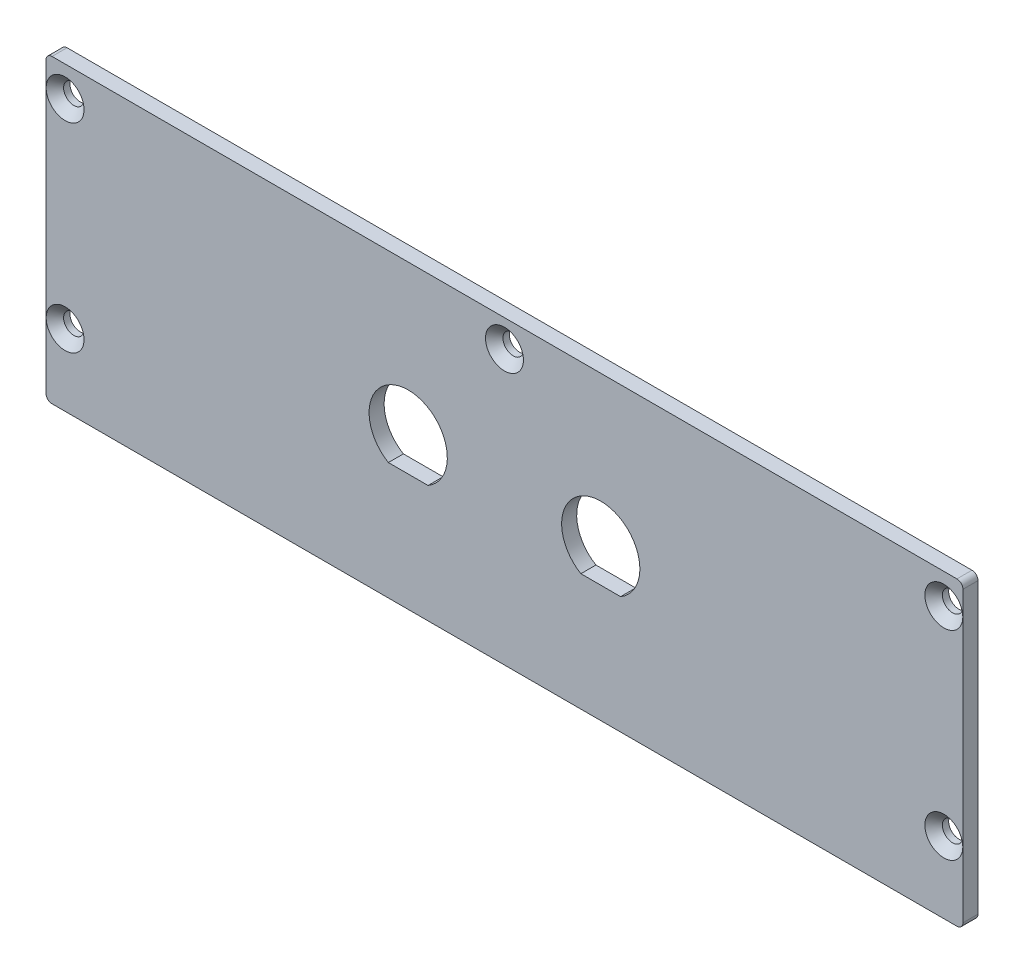
ISO-10303-21;
HEADER;
FILE_DESCRIPTION(('STEP AP214'),'2;1');
FILE_NAME('part.step','',(''),(''),'','','');
FILE_SCHEMA(('AUTOMOTIVE_DESIGN { 1 0 10303 214 1 1 1 1 }'));
ENDSEC;
DATA;
#1=APPLICATION_CONTEXT('core data for automotive mechanical design processes');
#2=APPLICATION_PROTOCOL_DEFINITION('international standard','automotive_design',2000,#1);
#3=PRODUCT_CONTEXT('',#1,'mechanical');
#4=PRODUCT('Part','Part','',(#3));
#5=PRODUCT_RELATED_PRODUCT_CATEGORY('part','',(#4));
#6=PRODUCT_DEFINITION_FORMATION('','',#4);
#7=PRODUCT_DEFINITION_CONTEXT('part definition',#1,'design');
#8=PRODUCT_DEFINITION('design','',#6,#7);
#9=PRODUCT_DEFINITION_SHAPE('','',#8);
#10=(LENGTH_UNIT() NAMED_UNIT(*) SI_UNIT(.MILLI.,.METRE.));
#11=(NAMED_UNIT(*) PLANE_ANGLE_UNIT() SI_UNIT($,.RADIAN.));
#12=(NAMED_UNIT(*) SI_UNIT($,.STERADIAN.) SOLID_ANGLE_UNIT());
#13=UNCERTAINTY_MEASURE_WITH_UNIT(LENGTH_MEASURE(1.E-05),#10,'distance_accuracy_value','');
#14=(GEOMETRIC_REPRESENTATION_CONTEXT(3) GLOBAL_UNCERTAINTY_ASSIGNED_CONTEXT((#13)) GLOBAL_UNIT_ASSIGNED_CONTEXT((#10,
#11,#12)) REPRESENTATION_CONTEXT('',''));
#15=CARTESIAN_POINT('',(0.,0.,0.));
#16=DIRECTION('',(0.,0.,1.));
#17=DIRECTION('',(1.,0.,0.));
#18=AXIS2_PLACEMENT_3D('',#15,#16,#17);
#19=CARTESIAN_POINT('',(75.2,-10.5598186222573,2.5));
#20=DIRECTION('',(0.,0.,-1.));
#21=DIRECTION('',(-1.,0.,0.));
#22=AXIS2_PLACEMENT_3D('',#19,#20,#21);
#23=CYLINDRICAL_SURFACE('',#22,1.);
#24=CARTESIAN_POINT('',(75.2,-10.5598186222573,0.));
#25=DIRECTION('',(0.,0.,1.));
#26=DIRECTION('',(-1.,0.,0.));
#27=AXIS2_PLACEMENT_3D('',#24,#25,#26);
#28=CIRCLE('',#27,1.);
#29=CARTESIAN_POINT('',(75.2,-11.5598186222573,0.));
#30=VERTEX_POINT('',#29);
#31=CARTESIAN_POINT('',(76.2,-10.5598186222573,0.));
#32=VERTEX_POINT('',#31);
#33=EDGE_CURVE('E199',#30,#32,#28,.T.);
#34=ORIENTED_EDGE('',*,*,#33,.T.);
#35=DIRECTION('',(0.,0.,-1.));
#36=VECTOR('',#35,1.);
#37=CARTESIAN_POINT('',(76.2,-10.5598186222573,2.5));
#38=LINE('',#37,#36);
#39=CARTESIAN_POINT('',(76.2,-10.5598186222573,2.5));
#40=VERTEX_POINT('',#39);
#41=EDGE_CURVE('E11',#40,#32,#38,.T.);
#42=ORIENTED_EDGE('',*,*,#41,.F.);
#43=CARTESIAN_POINT('',(75.2,-10.5598186222573,2.5));
#44=DIRECTION('',(0.,0.,1.));
#45=DIRECTION('',(-1.,0.,0.));
#46=AXIS2_PLACEMENT_3D('',#43,#44,#45);
#47=CIRCLE('',#46,1.);
#48=CARTESIAN_POINT('',(75.2,-11.5598186222573,2.5));
#49=VERTEX_POINT('',#48);
#50=EDGE_CURVE('E200',#49,#40,#47,.T.);
#51=ORIENTED_EDGE('',*,*,#50,.F.);
#52=DIRECTION('',(0.,0.,-1.));
#53=VECTOR('',#52,1.);
#54=CARTESIAN_POINT('',(75.2,-11.5598186222573,2.5));
#55=LINE('',#54,#53);
#56=EDGE_CURVE('E218',#49,#30,#55,.T.);
#57=ORIENTED_EDGE('',*,*,#56,.T.);
#58=EDGE_LOOP('',(#34,#42,#51,#57));
#59=FACE_BOUND('',#58,.T.);
#60=ADVANCED_FACE('F33',(#59),#23,.T.);
#61=CARTESIAN_POINT('',(76.2,37.4401813777427,2.5));
#62=DIRECTION('',(-1.,0.,0.));
#63=DIRECTION('',(0.,-1.,0.));
#64=AXIS2_PLACEMENT_3D('',#61,#62,#63);
#65=PLANE('',#64);
#66=DIRECTION('',(0.,1.,0.));
#67=VECTOR('',#66,1.);
#68=CARTESIAN_POINT('',(76.2,37.4401813777427,0.));
#69=LINE('',#68,#67);
#70=CARTESIAN_POINT('',(76.2,37.4401813777427,0.));
#71=VERTEX_POINT('',#70);
#72=EDGE_CURVE('E221',#32,#71,#69,.T.);
#73=ORIENTED_EDGE('',*,*,#72,.T.);
#74=DIRECTION('',(0.,0.,-1.));
#75=VECTOR('',#74,1.);
#76=CARTESIAN_POINT('',(76.2,37.4401813777427,2.5));
#77=LINE('',#76,#75);
#78=CARTESIAN_POINT('',(76.2,37.4401813777427,2.5));
#79=VERTEX_POINT('',#78);
#80=EDGE_CURVE('E40',#79,#71,#77,.T.);
#81=ORIENTED_EDGE('',*,*,#80,.F.);
#82=DIRECTION('',(0.,1.,0.));
#83=VECTOR('',#82,1.);
#84=CARTESIAN_POINT('',(76.2,37.4401813777427,2.5));
#85=LINE('',#84,#83);
#86=EDGE_CURVE('E203',#40,#79,#85,.T.);
#87=ORIENTED_EDGE('',*,*,#86,.F.);
#88=ORIENTED_EDGE('',*,*,#41,.T.);
#89=EDGE_LOOP('',(#73,#81,#87,#88));
#90=FACE_BOUND('',#89,.T.);
#91=ADVANCED_FACE('F277',(#90),#65,.F.);
#92=CARTESIAN_POINT('',(75.2,37.4401813777427,2.5));
#93=DIRECTION('',(0.,0.,-1.));
#94=DIRECTION('',(-1.,0.,0.));
#95=AXIS2_PLACEMENT_3D('',#92,#93,#94);
#96=CYLINDRICAL_SURFACE('',#95,0.999999999999997);
#97=CARTESIAN_POINT('',(75.2,37.4401813777427,0.));
#98=DIRECTION('',(0.,0.,1.));
#99=DIRECTION('',(1.,0.,0.));
#100=AXIS2_PLACEMENT_3D('',#97,#98,#99);
#101=CIRCLE('',#100,0.999999999999997);
#102=CARTESIAN_POINT('',(75.2,38.4401813777427,0.));
#103=VERTEX_POINT('',#102);
#104=EDGE_CURVE('E223',#71,#103,#101,.T.);
#105=ORIENTED_EDGE('',*,*,#104,.T.);
#106=DIRECTION('',(0.,0.,-1.));
#107=VECTOR('',#106,1.);
#108=CARTESIAN_POINT('',(75.2,38.4401813777427,2.5));
#109=LINE('',#108,#107);
#110=CARTESIAN_POINT('',(75.2,38.4401813777427,2.5));
#111=VERTEX_POINT('',#110);
#112=EDGE_CURVE('E248',#111,#103,#109,.T.);
#113=ORIENTED_EDGE('',*,*,#112,.F.);
#114=CARTESIAN_POINT('',(75.2,37.4401813777427,2.5));
#115=DIRECTION('',(0.,0.,1.));
#116=DIRECTION('',(1.,0.,0.));
#117=AXIS2_PLACEMENT_3D('',#114,#115,#116);
#118=CIRCLE('',#117,0.999999999999997);
#119=EDGE_CURVE('E206',#79,#111,#118,.T.);
#120=ORIENTED_EDGE('',*,*,#119,.F.);
#121=ORIENTED_EDGE('',*,*,#80,.T.);
#122=EDGE_LOOP('',(#105,#113,#120,#121));
#123=FACE_BOUND('',#122,.T.);
#124=ADVANCED_FACE('F255',(#123),#96,.T.);
#125=CARTESIAN_POINT('',(-75.2,38.4401813777427,2.5));
#126=DIRECTION('',(0.,-1.,0.));
#127=DIRECTION('',(0.,0.,-1.));
#128=AXIS2_PLACEMENT_3D('',#125,#126,#127);
#129=PLANE('',#128);
#130=DIRECTION('',(-1.,0.,0.));
#131=VECTOR('',#130,1.);
#132=CARTESIAN_POINT('',(-75.2,38.4401813777427,0.));
#133=LINE('',#132,#131);
#134=CARTESIAN_POINT('',(-75.2,38.4401813777427,0.));
#135=VERTEX_POINT('',#134);
#136=EDGE_CURVE('E225',#103,#135,#133,.T.);
#137=ORIENTED_EDGE('',*,*,#136,.T.);
#138=DIRECTION('',(0.,0.,-1.));
#139=VECTOR('',#138,1.);
#140=CARTESIAN_POINT('',(-75.2,38.4401813777427,2.5));
#141=LINE('',#140,#139);
#142=CARTESIAN_POINT('',(-75.2,38.4401813777427,2.5));
#143=VERTEX_POINT('',#142);
#144=EDGE_CURVE('E245',#143,#135,#141,.T.);
#145=ORIENTED_EDGE('',*,*,#144,.F.);
#146=DIRECTION('',(-1.,0.,0.));
#147=VECTOR('',#146,1.);
#148=CARTESIAN_POINT('',(-75.2,38.4401813777427,2.5));
#149=LINE('',#148,#147);
#150=EDGE_CURVE('E208',#111,#143,#149,.T.);
#151=ORIENTED_EDGE('',*,*,#150,.F.);
#152=ORIENTED_EDGE('',*,*,#112,.T.);
#153=EDGE_LOOP('',(#137,#145,#151,#152));
#154=FACE_BOUND('',#153,.T.);
#155=ADVANCED_FACE('F265',(#154),#129,.F.);
#156=CARTESIAN_POINT('',(-75.2,37.4401813777427,2.5));
#157=DIRECTION('',(0.,0.,-1.));
#158=DIRECTION('',(-1.,0.,0.));
#159=AXIS2_PLACEMENT_3D('',#156,#157,#158);
#160=CYLINDRICAL_SURFACE('',#159,0.999999999999997);
#161=CARTESIAN_POINT('',(-75.2,37.4401813777427,0.));
#162=DIRECTION('',(0.,0.,1.));
#163=DIRECTION('',(1.,0.,0.));
#164=AXIS2_PLACEMENT_3D('',#161,#162,#163);
#165=CIRCLE('',#164,0.999999999999997);
#166=CARTESIAN_POINT('',(-76.2,37.4401813777427,0.));
#167=VERTEX_POINT('',#166);
#168=EDGE_CURVE('E227',#135,#167,#165,.T.);
#169=ORIENTED_EDGE('',*,*,#168,.T.);
#170=DIRECTION('',(0.,0.,-1.));
#171=VECTOR('',#170,1.);
#172=CARTESIAN_POINT('',(-76.2,37.4401813777427,2.5));
#173=LINE('',#172,#171);
#174=CARTESIAN_POINT('',(-76.2,37.4401813777427,2.5));
#175=VERTEX_POINT('',#174);
#176=EDGE_CURVE('E242',#175,#167,#173,.T.);
#177=ORIENTED_EDGE('',*,*,#176,.F.);
#178=CARTESIAN_POINT('',(-75.2,37.4401813777427,2.5));
#179=DIRECTION('',(0.,0.,1.));
#180=DIRECTION('',(1.,0.,0.));
#181=AXIS2_PLACEMENT_3D('',#178,#179,#180);
#182=CIRCLE('',#181,0.999999999999997);
#183=EDGE_CURVE('E210',#143,#175,#182,.T.);
#184=ORIENTED_EDGE('',*,*,#183,.F.);
#185=ORIENTED_EDGE('',*,*,#144,.T.);
#186=EDGE_LOOP('',(#169,#177,#184,#185));
#187=FACE_BOUND('',#186,.T.);
#188=ADVANCED_FACE('F269',(#187),#160,.T.);
#189=CARTESIAN_POINT('',(-76.2,37.4401813777427,2.5));
#190=DIRECTION('',(1.,0.,0.));
#191=DIRECTION('',(0.,1.,0.));
#192=AXIS2_PLACEMENT_3D('',#189,#190,#191);
#193=PLANE('',#192);
#194=DIRECTION('',(0.,-1.,0.));
#195=VECTOR('',#194,1.);
#196=CARTESIAN_POINT('',(-76.2,37.4401813777427,0.));
#197=LINE('',#196,#195);
#198=CARTESIAN_POINT('',(-76.2,-10.5598186222573,0.));
#199=VERTEX_POINT('',#198);
#200=EDGE_CURVE('E229',#167,#199,#197,.T.);
#201=ORIENTED_EDGE('',*,*,#200,.T.);
#202=DIRECTION('',(0.,0.,-1.));
#203=VECTOR('',#202,1.);
#204=CARTESIAN_POINT('',(-76.2,-10.5598186222573,2.5));
#205=LINE('',#204,#203);
#206=CARTESIAN_POINT('',(-76.2,-10.5598186222573,2.5));
#207=VERTEX_POINT('',#206);
#208=EDGE_CURVE('E239',#207,#199,#205,.T.);
#209=ORIENTED_EDGE('',*,*,#208,.F.);
#210=DIRECTION('',(0.,-1.,0.));
#211=VECTOR('',#210,1.);
#212=CARTESIAN_POINT('',(-76.2,37.4401813777427,2.5));
#213=LINE('',#212,#211);
#214=EDGE_CURVE('E212',#175,#207,#213,.T.);
#215=ORIENTED_EDGE('',*,*,#214,.F.);
#216=ORIENTED_EDGE('',*,*,#176,.T.);
#217=EDGE_LOOP('',(#201,#209,#215,#216));
#218=FACE_BOUND('',#217,.T.);
#219=ADVANCED_FACE('F290',(#218),#193,.F.);
#220=CARTESIAN_POINT('',(-75.2,-10.5598186222573,2.5));
#221=DIRECTION('',(0.,0.,-1.));
#222=DIRECTION('',(-1.,0.,0.));
#223=AXIS2_PLACEMENT_3D('',#220,#221,#222);
#224=CYLINDRICAL_SURFACE('',#223,1.);
#225=CARTESIAN_POINT('',(-75.2,-10.5598186222573,0.));
#226=DIRECTION('',(0.,0.,1.));
#227=DIRECTION('',(-1.,0.,0.));
#228=AXIS2_PLACEMENT_3D('',#225,#226,#227);
#229=CIRCLE('',#228,1.);
#230=CARTESIAN_POINT('',(-75.2,-11.5598186222573,0.));
#231=VERTEX_POINT('',#230);
#232=EDGE_CURVE('E231',#199,#231,#229,.T.);
#233=ORIENTED_EDGE('',*,*,#232,.T.);
#234=DIRECTION('',(0.,0.,-1.));
#235=VECTOR('',#234,1.);
#236=CARTESIAN_POINT('',(-75.2,-11.5598186222573,2.5));
#237=LINE('',#236,#235);
#238=CARTESIAN_POINT('',(-75.2,-11.5598186222573,2.5));
#239=VERTEX_POINT('',#238);
#240=EDGE_CURVE('E236',#239,#231,#237,.T.);
#241=ORIENTED_EDGE('',*,*,#240,.F.);
#242=CARTESIAN_POINT('',(-75.2,-10.5598186222573,2.5));
#243=DIRECTION('',(0.,0.,1.));
#244=DIRECTION('',(-1.,0.,0.));
#245=AXIS2_PLACEMENT_3D('',#242,#243,#244);
#246=CIRCLE('',#245,1.);
#247=EDGE_CURVE('E214',#207,#239,#246,.T.);
#248=ORIENTED_EDGE('',*,*,#247,.F.);
#249=ORIENTED_EDGE('',*,*,#208,.T.);
#250=EDGE_LOOP('',(#233,#241,#248,#249));
#251=FACE_BOUND('',#250,.T.);
#252=ADVANCED_FACE('F288',(#251),#224,.T.);
#253=CARTESIAN_POINT('',(-75.2,-11.5598186222573,2.5));
#254=DIRECTION('',(0.,1.,0.));
#255=DIRECTION('',(0.,0.,1.));
#256=AXIS2_PLACEMENT_3D('',#253,#254,#255);
#257=PLANE('',#256);
#258=DIRECTION('',(1.,0.,0.));
#259=VECTOR('',#258,1.);
#260=CARTESIAN_POINT('',(-75.2,-11.5598186222573,0.));
#261=LINE('',#260,#259);
#262=EDGE_CURVE('E204',#231,#30,#261,.T.);
#263=ORIENTED_EDGE('',*,*,#262,.T.);
#264=ORIENTED_EDGE('',*,*,#56,.F.);
#265=DIRECTION('',(1.,0.,0.));
#266=VECTOR('',#265,1.);
#267=CARTESIAN_POINT('',(-75.2,-11.5598186222573,2.5));
#268=LINE('',#267,#266);
#269=EDGE_CURVE('E216',#239,#49,#268,.T.);
#270=ORIENTED_EDGE('',*,*,#269,.F.);
#271=ORIENTED_EDGE('',*,*,#240,.T.);
#272=EDGE_LOOP('',(#263,#264,#270,#271));
#273=FACE_BOUND('',#272,.T.);
#274=ADVANCED_FACE('F283',(#273),#257,.F.);
#275=CARTESIAN_POINT('',(75.2,-10.5598186222573,2.5));
#276=DIRECTION('',(0.,0.,-1.));
#277=DIRECTION('',(-1.,0.,0.));
#278=AXIS2_PLACEMENT_3D('',#275,#276,#277);
#279=PLANE('',#278);
#280=CARTESIAN_POINT('',(16.,13.5355698148128,2.5));
#281=DIRECTION('',(0.,0.,1.));
#282=DIRECTION('',(1.,0.,0.));
#283=AXIS2_PLACEMENT_3D('',#280,#281,#282);
#284=CIRCLE('',#283,6.5);
#285=CARTESIAN_POINT('',(19.3,7.93556981481283,2.5));
#286=VERTEX_POINT('',#285);
#287=CARTESIAN_POINT('',(12.7,7.93556981481283,2.5));
#288=VERTEX_POINT('',#287);
#289=EDGE_CURVE('E132',#286,#288,#284,.T.);
#290=ORIENTED_EDGE('',*,*,#289,.F.);
#291=DIRECTION('',(1.,0.,0.));
#292=VECTOR('',#291,1.);
#293=CARTESIAN_POINT('',(0.,7.93556981481283,2.5));
#294=LINE('',#293,#292);
#295=EDGE_CURVE('E47',#288,#286,#294,.T.);
#296=ORIENTED_EDGE('',*,*,#295,.F.);
#297=EDGE_LOOP('',(#290,#296));
#298=FACE_BOUND('',#297,.T.);
#299=CARTESIAN_POINT('',(-16.,13.5355698148128,2.5));
#300=DIRECTION('',(0.,0.,1.));
#301=DIRECTION('',(1.,0.,0.));
#302=AXIS2_PLACEMENT_3D('',#299,#300,#301);
#303=CIRCLE('',#302,6.5);
#304=CARTESIAN_POINT('',(-12.7,7.93556981481283,2.5));
#305=VERTEX_POINT('',#304);
#306=CARTESIAN_POINT('',(-19.3,7.93556981481283,2.5));
#307=VERTEX_POINT('',#306);
#308=EDGE_CURVE('E143',#305,#307,#303,.T.);
#309=ORIENTED_EDGE('',*,*,#308,.F.);
#310=DIRECTION('',(1.,0.,0.));
#311=VECTOR('',#310,1.);
#312=CARTESIAN_POINT('',(0.,7.93556981481283,2.5));
#313=LINE('',#312,#311);
#314=EDGE_CURVE('E137',#307,#305,#313,.T.);
#315=ORIENTED_EDGE('',*,*,#314,.F.);
#316=EDGE_LOOP('',(#309,#315));
#317=FACE_BOUND('',#316,.T.);
#318=CARTESIAN_POINT('',(-73.025,33.4401813777427,2.5));
#319=DIRECTION('',(0.,0.,1.));
#320=DIRECTION('',(1.,0.,0.));
#321=AXIS2_PLACEMENT_3D('',#318,#319,#320);
#322=CIRCLE('',#321,3.15);
#323=CARTESIAN_POINT('',(-69.875,33.4401813777427,2.5));
#324=VERTEX_POINT('',#323);
#325=EDGE_CURVE('E152',#324,#324,#322,.T.);
#326=ORIENTED_EDGE('',*,*,#325,.F.);
#327=EDGE_LOOP('',(#326));
#328=FACE_BOUND('',#327,.T.);
#329=CARTESIAN_POINT('',(-73.025,0.34018137774275,2.5));
#330=DIRECTION('',(0.,0.,1.));
#331=DIRECTION('',(1.,0.,0.));
#332=AXIS2_PLACEMENT_3D('',#329,#330,#331);
#333=CIRCLE('',#332,3.15);
#334=CARTESIAN_POINT('',(-69.875,0.34018137774275,2.5));
#335=VERTEX_POINT('',#334);
#336=EDGE_CURVE('E163',#335,#335,#333,.T.);
#337=ORIENTED_EDGE('',*,*,#336,.F.);
#338=EDGE_LOOP('',(#337));
#339=FACE_BOUND('',#338,.T.);
#340=CARTESIAN_POINT('',(0.,33.91520047402,2.5));
#341=DIRECTION('',(0.,0.,1.));
#342=DIRECTION('',(1.,0.,0.));
#343=AXIS2_PLACEMENT_3D('',#340,#341,#342);
#344=CIRCLE('',#343,3.15);
#345=CARTESIAN_POINT('',(3.14999999999997,33.91520047402,2.5));
#346=VERTEX_POINT('',#345);
#347=EDGE_CURVE('E172',#346,#346,#344,.T.);
#348=ORIENTED_EDGE('',*,*,#347,.F.);
#349=EDGE_LOOP('',(#348));
#350=FACE_BOUND('',#349,.T.);
#351=CARTESIAN_POINT('',(73.025,33.4401813777428,2.5));
#352=DIRECTION('',(0.,0.,1.));
#353=DIRECTION('',(1.,0.,0.));
#354=AXIS2_PLACEMENT_3D('',#351,#352,#353);
#355=CIRCLE('',#354,3.15);
#356=CARTESIAN_POINT('',(76.175,33.4401813777428,2.5));
#357=VERTEX_POINT('',#356);
#358=EDGE_CURVE('E181',#357,#357,#355,.T.);
#359=ORIENTED_EDGE('',*,*,#358,.F.);
#360=EDGE_LOOP('',(#359));
#361=FACE_BOUND('',#360,.T.);
#362=CARTESIAN_POINT('',(73.025,0.34018137774282,2.5));
#363=DIRECTION('',(0.,0.,1.));
#364=DIRECTION('',(1.,0.,0.));
#365=AXIS2_PLACEMENT_3D('',#362,#363,#364);
#366=CIRCLE('',#365,3.15);
#367=CARTESIAN_POINT('',(76.175,0.34018137774282,2.5));
#368=VERTEX_POINT('',#367);
#369=EDGE_CURVE('E190',#368,#368,#366,.T.);
#370=ORIENTED_EDGE('',*,*,#369,.F.);
#371=EDGE_LOOP('',(#370));
#372=FACE_BOUND('',#371,.T.);
#373=ORIENTED_EDGE('',*,*,#50,.T.);
#374=ORIENTED_EDGE('',*,*,#86,.T.);
#375=ORIENTED_EDGE('',*,*,#119,.T.);
#376=ORIENTED_EDGE('',*,*,#150,.T.);
#377=ORIENTED_EDGE('',*,*,#183,.T.);
#378=ORIENTED_EDGE('',*,*,#214,.T.);
#379=ORIENTED_EDGE('',*,*,#247,.T.);
#380=ORIENTED_EDGE('',*,*,#269,.T.);
#381=EDGE_LOOP('',(#373,#374,#375,#376,#377,#378,#379,#380));
#382=FACE_BOUND('',#381,.T.);
#383=ADVANCED_FACE('F273',(#298,#317,#328,#339,#350,#361,#372,#382),#279,.F.);
#384=CARTESIAN_POINT('',(75.2,-10.5598186222573,0.));
#385=DIRECTION('',(0.,0.,-1.));
#386=DIRECTION('',(-1.,0.,0.));
#387=AXIS2_PLACEMENT_3D('',#384,#385,#386);
#388=PLANE('',#387);
#389=DIRECTION('',(1.,0.,0.));
#390=VECTOR('',#389,1.);
#391=CARTESIAN_POINT('',(0.,7.93556981481283,0.));
#392=LINE('',#391,#390);
#393=CARTESIAN_POINT('',(12.7,7.93556981481283,0.));
#394=VERTEX_POINT('',#393);
#395=CARTESIAN_POINT('',(19.3,7.93556981481283,0.));
#396=VERTEX_POINT('',#395);
#397=EDGE_CURVE('E52',#394,#396,#392,.T.);
#398=ORIENTED_EDGE('',*,*,#397,.T.);
#399=CARTESIAN_POINT('',(16.,13.5355698148128,0.));
#400=DIRECTION('',(0.,0.,1.));
#401=DIRECTION('',(1.,0.,0.));
#402=AXIS2_PLACEMENT_3D('',#399,#400,#401);
#403=CIRCLE('',#402,6.5);
#404=EDGE_CURVE('E124',#396,#394,#403,.T.);
#405=ORIENTED_EDGE('',*,*,#404,.T.);
#406=EDGE_LOOP('',(#398,#405));
#407=FACE_BOUND('',#406,.T.);
#408=DIRECTION('',(1.,0.,0.));
#409=VECTOR('',#408,1.);
#410=CARTESIAN_POINT('',(0.,7.93556981481283,0.));
#411=LINE('',#410,#409);
#412=CARTESIAN_POINT('',(-19.3,7.93556981481283,0.));
#413=VERTEX_POINT('',#412);
#414=CARTESIAN_POINT('',(-12.7,7.93556981481283,0.));
#415=VERTEX_POINT('',#414);
#416=EDGE_CURVE('E139',#413,#415,#411,.T.);
#417=ORIENTED_EDGE('',*,*,#416,.T.);
#418=CARTESIAN_POINT('',(-16.,13.5355698148128,0.));
#419=DIRECTION('',(0.,0.,1.));
#420=DIRECTION('',(1.,0.,0.));
#421=AXIS2_PLACEMENT_3D('',#418,#419,#420);
#422=CIRCLE('',#421,6.5);
#423=EDGE_CURVE('E142',#415,#413,#422,.T.);
#424=ORIENTED_EDGE('',*,*,#423,.T.);
#425=EDGE_LOOP('',(#417,#424));
#426=FACE_BOUND('',#425,.T.);
#427=CARTESIAN_POINT('',(-73.025,33.4401813777427,0.));
#428=DIRECTION('',(0.,0.,1.));
#429=DIRECTION('',(1.,0.,0.));
#430=AXIS2_PLACEMENT_3D('',#427,#428,#429);
#431=CIRCLE('',#430,1.69999999999999);
#432=CARTESIAN_POINT('',(-71.325,33.4401813777427,0.));
#433=VERTEX_POINT('',#432);
#434=EDGE_CURVE('E160',#433,#433,#431,.T.);
#435=ORIENTED_EDGE('',*,*,#434,.T.);
#436=EDGE_LOOP('',(#435));
#437=FACE_BOUND('',#436,.T.);
#438=CARTESIAN_POINT('',(-73.025,0.34018137774275,0.));
#439=DIRECTION('',(0.,0.,1.));
#440=DIRECTION('',(1.,0.,0.));
#441=AXIS2_PLACEMENT_3D('',#438,#439,#440);
#442=CIRCLE('',#441,1.69999999999999);
#443=CARTESIAN_POINT('',(-71.325,0.34018137774275,0.));
#444=VERTEX_POINT('',#443);
#445=EDGE_CURVE('E169',#444,#444,#442,.T.);
#446=ORIENTED_EDGE('',*,*,#445,.T.);
#447=EDGE_LOOP('',(#446));
#448=FACE_BOUND('',#447,.T.);
#449=CARTESIAN_POINT('',(0.,33.91520047402,0.));
#450=DIRECTION('',(0.,0.,1.));
#451=DIRECTION('',(1.,0.,0.));
#452=AXIS2_PLACEMENT_3D('',#449,#450,#451);
#453=CIRCLE('',#452,1.7);
#454=CARTESIAN_POINT('',(1.69999999999996,33.91520047402,0.));
#455=VERTEX_POINT('',#454);
#456=EDGE_CURVE('E178',#455,#455,#453,.T.);
#457=ORIENTED_EDGE('',*,*,#456,.T.);
#458=EDGE_LOOP('',(#457));
#459=FACE_BOUND('',#458,.T.);
#460=CARTESIAN_POINT('',(73.025,33.4401813777428,0.));
#461=DIRECTION('',(0.,0.,1.));
#462=DIRECTION('',(1.,0.,0.));
#463=AXIS2_PLACEMENT_3D('',#460,#461,#462);
#464=CIRCLE('',#463,1.69999999999999);
#465=CARTESIAN_POINT('',(74.725,33.4401813777428,0.));
#466=VERTEX_POINT('',#465);
#467=EDGE_CURVE('E187',#466,#466,#464,.T.);
#468=ORIENTED_EDGE('',*,*,#467,.T.);
#469=EDGE_LOOP('',(#468));
#470=FACE_BOUND('',#469,.T.);
#471=CARTESIAN_POINT('',(73.025,0.34018137774282,0.));
#472=DIRECTION('',(0.,0.,1.));
#473=DIRECTION('',(1.,0.,0.));
#474=AXIS2_PLACEMENT_3D('',#471,#472,#473);
#475=CIRCLE('',#474,1.69999999999999);
#476=CARTESIAN_POINT('',(74.725,0.34018137774282,0.));
#477=VERTEX_POINT('',#476);
#478=EDGE_CURVE('E196',#477,#477,#475,.T.);
#479=ORIENTED_EDGE('',*,*,#478,.T.);
#480=EDGE_LOOP('',(#479));
#481=FACE_BOUND('',#480,.T.);
#482=ORIENTED_EDGE('',*,*,#33,.F.);
#483=ORIENTED_EDGE('',*,*,#262,.F.);
#484=ORIENTED_EDGE('',*,*,#232,.F.);
#485=ORIENTED_EDGE('',*,*,#200,.F.);
#486=ORIENTED_EDGE('',*,*,#168,.F.);
#487=ORIENTED_EDGE('',*,*,#136,.F.);
#488=ORIENTED_EDGE('',*,*,#104,.F.);
#489=ORIENTED_EDGE('',*,*,#72,.F.);
#490=EDGE_LOOP('',(#482,#483,#484,#485,#486,#487,#488,#489));
#491=FACE_BOUND('',#490,.T.);
#492=ADVANCED_FACE('F130',(#407,#426,#437,#448,#459,#470,#481,#491),#388,.T.);
#493=CARTESIAN_POINT('',(73.025,0.34018137774282,2.5));
#494=DIRECTION('',(0.,0.,1.));
#495=DIRECTION('',(1.,0.,0.));
#496=AXIS2_PLACEMENT_3D('',#493,#494,#495);
#497=CYLINDRICAL_SURFACE('',#496,1.69999999999999);
#498=ORIENTED_EDGE('',*,*,#478,.F.);
#499=EDGE_LOOP('',(#498));
#500=FACE_BOUND('',#499,.T.);
#501=CARTESIAN_POINT('',(73.025,0.34018137774282,1.05));
#502=DIRECTION('',(0.,0.,1.));
#503=DIRECTION('',(1.,0.,0.));
#504=AXIS2_PLACEMENT_3D('',#501,#502,#503);
#505=CIRCLE('',#504,1.69999999999999);
#506=CARTESIAN_POINT('',(74.725,0.34018137774282,1.05));
#507=VERTEX_POINT('',#506);
#508=EDGE_CURVE('E193',#507,#507,#505,.T.);
#509=ORIENTED_EDGE('',*,*,#508,.T.);
#510=EDGE_LOOP('',(#509));
#511=FACE_BOUND('',#510,.T.);
#512=ADVANCED_FACE('F342',(#500,#511),#497,.F.);
#513=CARTESIAN_POINT('',(73.025,0.34018137774282,2.5));
#514=DIRECTION('',(0.,0.,1.));
#515=DIRECTION('',(1.,0.,0.));
#516=AXIS2_PLACEMENT_3D('',#513,#514,#515);
#517=CONICAL_SURFACE('',#516,3.15,0.785398163397449);
#518=ORIENTED_EDGE('',*,*,#508,.F.);
#519=EDGE_LOOP('',(#518));
#520=FACE_BOUND('',#519,.T.);
#521=ORIENTED_EDGE('',*,*,#369,.T.);
#522=EDGE_LOOP('',(#521));
#523=FACE_BOUND('',#522,.T.);
#524=ADVANCED_FACE('F347',(#520,#523),#517,.F.);
#525=CARTESIAN_POINT('',(73.025,33.4401813777428,2.5));
#526=DIRECTION('',(0.,0.,1.));
#527=DIRECTION('',(1.,0.,0.));
#528=AXIS2_PLACEMENT_3D('',#525,#526,#527);
#529=CYLINDRICAL_SURFACE('',#528,1.69999999999999);
#530=ORIENTED_EDGE('',*,*,#467,.F.);
#531=EDGE_LOOP('',(#530));
#532=FACE_BOUND('',#531,.T.);
#533=CARTESIAN_POINT('',(73.025,33.4401813777428,1.05));
#534=DIRECTION('',(0.,0.,1.));
#535=DIRECTION('',(1.,0.,0.));
#536=AXIS2_PLACEMENT_3D('',#533,#534,#535);
#537=CIRCLE('',#536,1.69999999999999);
#538=CARTESIAN_POINT('',(74.725,33.4401813777428,1.05));
#539=VERTEX_POINT('',#538);
#540=EDGE_CURVE('E184',#539,#539,#537,.T.);
#541=ORIENTED_EDGE('',*,*,#540,.T.);
#542=EDGE_LOOP('',(#541));
#543=FACE_BOUND('',#542,.T.);
#544=ADVANCED_FACE('F359',(#532,#543),#529,.F.);
#545=CARTESIAN_POINT('',(73.025,33.4401813777428,2.5));
#546=DIRECTION('',(0.,0.,1.));
#547=DIRECTION('',(1.,0.,0.));
#548=AXIS2_PLACEMENT_3D('',#545,#546,#547);
#549=CONICAL_SURFACE('',#548,3.15,0.785398163397449);
#550=ORIENTED_EDGE('',*,*,#540,.F.);
#551=EDGE_LOOP('',(#550));
#552=FACE_BOUND('',#551,.T.);
#553=ORIENTED_EDGE('',*,*,#358,.T.);
#554=EDGE_LOOP('',(#553));
#555=FACE_BOUND('',#554,.T.);
#556=ADVANCED_FACE('F369',(#552,#555),#549,.F.);
#557=CARTESIAN_POINT('',(0.,33.91520047402,2.5));
#558=DIRECTION('',(0.,0.,1.));
#559=DIRECTION('',(1.,0.,0.));
#560=AXIS2_PLACEMENT_3D('',#557,#558,#559);
#561=CYLINDRICAL_SURFACE('',#560,1.7);
#562=ORIENTED_EDGE('',*,*,#456,.F.);
#563=EDGE_LOOP('',(#562));
#564=FACE_BOUND('',#563,.T.);
#565=CARTESIAN_POINT('',(0.,33.91520047402,1.05));
#566=DIRECTION('',(0.,0.,1.));
#567=DIRECTION('',(1.,0.,0.));
#568=AXIS2_PLACEMENT_3D('',#565,#566,#567);
#569=CIRCLE('',#568,1.7);
#570=CARTESIAN_POINT('',(1.69999999999996,33.91520047402,1.05));
#571=VERTEX_POINT('',#570);
#572=EDGE_CURVE('E175',#571,#571,#569,.T.);
#573=ORIENTED_EDGE('',*,*,#572,.T.);
#574=EDGE_LOOP('',(#573));
#575=FACE_BOUND('',#574,.T.);
#576=ADVANCED_FACE('F379',(#564,#575),#561,.F.);
#577=CARTESIAN_POINT('',(0.,33.91520047402,2.5));
#578=DIRECTION('',(0.,0.,1.));
#579=DIRECTION('',(1.,0.,0.));
#580=AXIS2_PLACEMENT_3D('',#577,#578,#579);
#581=CONICAL_SURFACE('',#580,3.15,0.785398163397447);
#582=ORIENTED_EDGE('',*,*,#572,.F.);
#583=EDGE_LOOP('',(#582));
#584=FACE_BOUND('',#583,.T.);
#585=ORIENTED_EDGE('',*,*,#347,.T.);
#586=EDGE_LOOP('',(#585));
#587=FACE_BOUND('',#586,.T.);
#588=ADVANCED_FACE('F389',(#584,#587),#581,.F.);
#589=CARTESIAN_POINT('',(-73.025,0.34018137774275,2.5));
#590=DIRECTION('',(0.,0.,1.));
#591=DIRECTION('',(1.,0.,0.));
#592=AXIS2_PLACEMENT_3D('',#589,#590,#591);
#593=CYLINDRICAL_SURFACE('',#592,1.69999999999999);
#594=ORIENTED_EDGE('',*,*,#445,.F.);
#595=EDGE_LOOP('',(#594));
#596=FACE_BOUND('',#595,.T.);
#597=CARTESIAN_POINT('',(-73.025,0.34018137774275,1.05));
#598=DIRECTION('',(0.,0.,1.));
#599=DIRECTION('',(1.,0.,0.));
#600=AXIS2_PLACEMENT_3D('',#597,#598,#599);
#601=CIRCLE('',#600,1.69999999999999);
#602=CARTESIAN_POINT('',(-71.325,0.34018137774275,1.05));
#603=VERTEX_POINT('',#602);
#604=EDGE_CURVE('E166',#603,#603,#601,.T.);
#605=ORIENTED_EDGE('',*,*,#604,.T.);
#606=EDGE_LOOP('',(#605));
#607=FACE_BOUND('',#606,.T.);
#608=ADVANCED_FACE('F399',(#596,#607),#593,.F.);
#609=CARTESIAN_POINT('',(-73.025,0.34018137774275,2.5));
#610=DIRECTION('',(0.,0.,1.));
#611=DIRECTION('',(1.,0.,0.));
#612=AXIS2_PLACEMENT_3D('',#609,#610,#611);
#613=CONICAL_SURFACE('',#612,3.15,0.785398163397449);
#614=ORIENTED_EDGE('',*,*,#604,.F.);
#615=EDGE_LOOP('',(#614));
#616=FACE_BOUND('',#615,.T.);
#617=ORIENTED_EDGE('',*,*,#336,.T.);
#618=EDGE_LOOP('',(#617));
#619=FACE_BOUND('',#618,.T.);
#620=ADVANCED_FACE('F409',(#616,#619),#613,.F.);
#621=CARTESIAN_POINT('',(-73.025,33.4401813777427,2.5));
#622=DIRECTION('',(0.,0.,1.));
#623=DIRECTION('',(1.,0.,0.));
#624=AXIS2_PLACEMENT_3D('',#621,#622,#623);
#625=CYLINDRICAL_SURFACE('',#624,1.69999999999999);
#626=ORIENTED_EDGE('',*,*,#434,.F.);
#627=EDGE_LOOP('',(#626));
#628=FACE_BOUND('',#627,.T.);
#629=CARTESIAN_POINT('',(-73.025,33.4401813777427,1.05));
#630=DIRECTION('',(0.,0.,1.));
#631=DIRECTION('',(1.,0.,0.));
#632=AXIS2_PLACEMENT_3D('',#629,#630,#631);
#633=CIRCLE('',#632,1.69999999999999);
#634=CARTESIAN_POINT('',(-71.325,33.4401813777427,1.05));
#635=VERTEX_POINT('',#634);
#636=EDGE_CURVE('E157',#635,#635,#633,.T.);
#637=ORIENTED_EDGE('',*,*,#636,.T.);
#638=EDGE_LOOP('',(#637));
#639=FACE_BOUND('',#638,.T.);
#640=ADVANCED_FACE('F419',(#628,#639),#625,.F.);
#641=CARTESIAN_POINT('',(-73.025,33.4401813777427,2.5));
#642=DIRECTION('',(0.,0.,1.));
#643=DIRECTION('',(1.,0.,0.));
#644=AXIS2_PLACEMENT_3D('',#641,#642,#643);
#645=CONICAL_SURFACE('',#644,3.15,0.785398163397449);
#646=ORIENTED_EDGE('',*,*,#636,.F.);
#647=EDGE_LOOP('',(#646));
#648=FACE_BOUND('',#647,.T.);
#649=ORIENTED_EDGE('',*,*,#325,.T.);
#650=EDGE_LOOP('',(#649));
#651=FACE_BOUND('',#650,.T.);
#652=ADVANCED_FACE('F429',(#648,#651),#645,.F.);
#653=CARTESIAN_POINT('',(0.,7.93556981481283,0.));
#654=DIRECTION('',(0.,-1.,0.));
#655=DIRECTION('',(0.,0.,-1.));
#656=AXIS2_PLACEMENT_3D('',#653,#654,#655);
#657=PLANE('',#656);
#658=ORIENTED_EDGE('',*,*,#314,.T.);
#659=DIRECTION('',(0.,0.,1.));
#660=VECTOR('',#659,1.);
#661=CARTESIAN_POINT('',(-12.7,7.93556981481283,0.));
#662=LINE('',#661,#660);
#663=EDGE_CURVE('E146',#415,#305,#662,.T.);
#664=ORIENTED_EDGE('',*,*,#663,.F.);
#665=ORIENTED_EDGE('',*,*,#416,.F.);
#666=DIRECTION('',(0.,0.,1.));
#667=VECTOR('',#666,1.);
#668=CARTESIAN_POINT('',(-19.3,7.93556981481283,0.));
#669=LINE('',#668,#667);
#670=EDGE_CURVE('E150',#413,#307,#669,.T.);
#671=ORIENTED_EDGE('',*,*,#670,.T.);
#672=EDGE_LOOP('',(#658,#664,#665,#671));
#673=FACE_BOUND('',#672,.T.);
#674=ADVANCED_FACE('F439',(#673),#657,.F.);
#675=CARTESIAN_POINT('',(-16.,13.5355698148128,0.));
#676=DIRECTION('',(0.,0.,1.));
#677=DIRECTION('',(1.,0.,0.));
#678=AXIS2_PLACEMENT_3D('',#675,#676,#677);
#679=CYLINDRICAL_SURFACE('',#678,6.5);
#680=ORIENTED_EDGE('',*,*,#308,.T.);
#681=ORIENTED_EDGE('',*,*,#670,.F.);
#682=ORIENTED_EDGE('',*,*,#423,.F.);
#683=ORIENTED_EDGE('',*,*,#663,.T.);
#684=EDGE_LOOP('',(#680,#681,#682,#683));
#685=FACE_BOUND('',#684,.T.);
#686=ADVANCED_FACE('F458',(#685),#679,.F.);
#687=CARTESIAN_POINT('',(0.,7.93556981481283,0.));
#688=DIRECTION('',(0.,-1.,0.));
#689=DIRECTION('',(0.,0.,-1.));
#690=AXIS2_PLACEMENT_3D('',#687,#688,#689);
#691=PLANE('',#690);
#692=ORIENTED_EDGE('',*,*,#295,.T.);
#693=DIRECTION('',(0.,0.,1.));
#694=VECTOR('',#693,1.);
#695=CARTESIAN_POINT('',(19.3,7.93556981481283,0.));
#696=LINE('',#695,#694);
#697=EDGE_CURVE('E117',#396,#286,#696,.T.);
#698=ORIENTED_EDGE('',*,*,#697,.F.);
#699=ORIENTED_EDGE('',*,*,#397,.F.);
#700=DIRECTION('',(0.,0.,1.));
#701=VECTOR('',#700,1.);
#702=CARTESIAN_POINT('',(12.7,7.93556981481283,0.));
#703=LINE('',#702,#701);
#704=EDGE_CURVE('E123',#394,#288,#703,.T.);
#705=ORIENTED_EDGE('',*,*,#704,.T.);
#706=EDGE_LOOP('',(#692,#698,#699,#705));
#707=FACE_BOUND('',#706,.T.);
#708=ADVANCED_FACE('F119',(#707),#691,.F.);
#709=CARTESIAN_POINT('',(16.,13.5355698148128,0.));
#710=DIRECTION('',(0.,0.,1.));
#711=DIRECTION('',(1.,0.,0.));
#712=AXIS2_PLACEMENT_3D('',#709,#710,#711);
#713=CYLINDRICAL_SURFACE('',#712,6.5);
#714=ORIENTED_EDGE('',*,*,#289,.T.);
#715=ORIENTED_EDGE('',*,*,#704,.F.);
#716=ORIENTED_EDGE('',*,*,#404,.F.);
#717=ORIENTED_EDGE('',*,*,#697,.T.);
#718=EDGE_LOOP('',(#714,#715,#716,#717));
#719=FACE_BOUND('',#718,.T.);
#720=ADVANCED_FACE('F127',(#719),#713,.F.);
#721=CLOSED_SHELL('',(#60,#91,#124,#155,#188,#219,#252,#274,#383,#492,#512,#524,#544,#556,#576,
#588,#608,#620,#640,#652,#674,#686,#708,#720));
#722=MANIFOLD_SOLID_BREP('B2',#721);
#723=ADVANCED_BREP_SHAPE_REPRESENTATION('',(#18,#722),#14);
#724=SHAPE_DEFINITION_REPRESENTATION(#9,#723);
ENDSEC;
END-ISO-10303-21;
